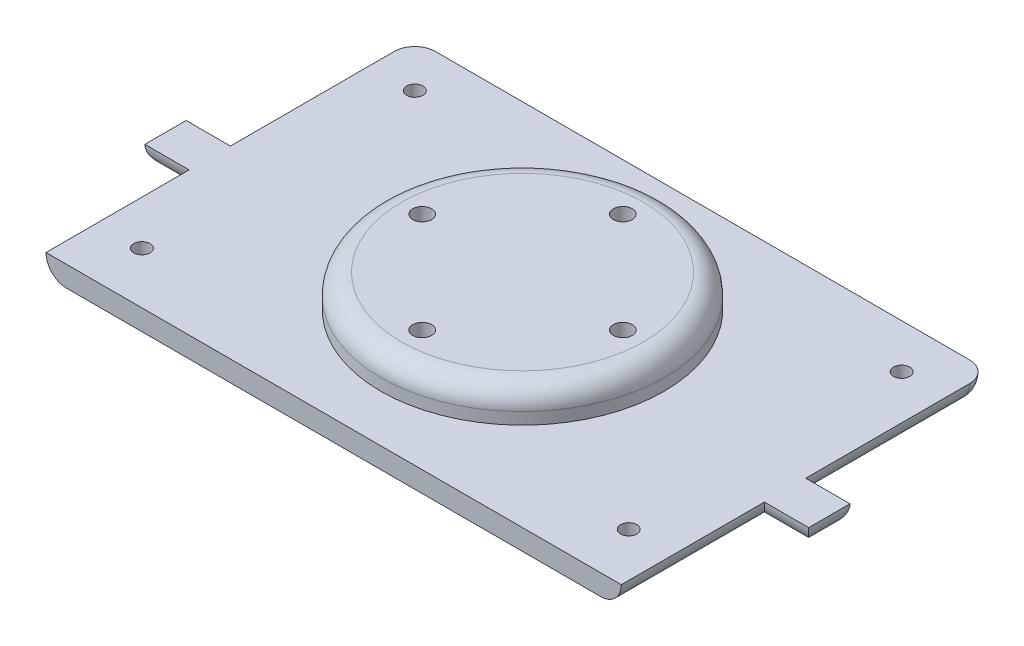
ISO-10303-21;
HEADER;
FILE_DESCRIPTION(('STEP AP214'),'2;1');
FILE_NAME('part.step','',(''),(''),'','','');
FILE_SCHEMA(('AUTOMOTIVE_DESIGN { 1 0 10303 214 1 1 1 1 }'));
ENDSEC;
DATA;
#1=APPLICATION_CONTEXT('core data for automotive mechanical design processes');
#2=APPLICATION_PROTOCOL_DEFINITION('international standard','automotive_design',2000,#1);
#3=PRODUCT_CONTEXT('',#1,'mechanical');
#4=PRODUCT('Part','Part','',(#3));
#5=PRODUCT_RELATED_PRODUCT_CATEGORY('part','',(#4));
#6=PRODUCT_DEFINITION_FORMATION('','',#4);
#7=PRODUCT_DEFINITION_CONTEXT('part definition',#1,'design');
#8=PRODUCT_DEFINITION('design','',#6,#7);
#9=PRODUCT_DEFINITION_SHAPE('','',#8);
#10=(LENGTH_UNIT() NAMED_UNIT(*) SI_UNIT(.MILLI.,.METRE.));
#11=(NAMED_UNIT(*) PLANE_ANGLE_UNIT() SI_UNIT($,.RADIAN.));
#12=(NAMED_UNIT(*) SI_UNIT($,.STERADIAN.) SOLID_ANGLE_UNIT());
#13=UNCERTAINTY_MEASURE_WITH_UNIT(LENGTH_MEASURE(1.E-05),#10,'distance_accuracy_value','');
#14=(GEOMETRIC_REPRESENTATION_CONTEXT(3) GLOBAL_UNCERTAINTY_ASSIGNED_CONTEXT((#13)) GLOBAL_UNIT_ASSIGNED_CONTEXT((#10,
#11,#12)) REPRESENTATION_CONTEXT('',''));
#15=CARTESIAN_POINT('',(0.,0.,0.));
#16=DIRECTION('',(0.,0.,1.));
#17=DIRECTION('',(1.,0.,0.));
#18=AXIS2_PLACEMENT_3D('',#15,#16,#17);
#19=CARTESIAN_POINT('',(0.,0.,0.));
#20=DIRECTION('',(0.,1.,0.));
#21=DIRECTION('',(0.,0.,1.));
#22=AXIS2_PLACEMENT_3D('',#19,#20,#21);
#23=PLANE('',#22);
#24=CARTESIAN_POINT('',(82.5,0.,-17.5));
#25=DIRECTION('',(0.,-1.,0.));
#26=DIRECTION('',(0.,0.,1.));
#27=AXIS2_PLACEMENT_3D('',#24,#25,#26);
#28=CIRCLE('',#27,2.75000000000001);
#29=CARTESIAN_POINT('',(82.5,0.,-14.75));
#30=VERTEX_POINT('',#29);
#31=EDGE_CURVE('E279',#30,#30,#28,.T.);
#32=ORIENTED_EDGE('',*,*,#31,.F.);
#33=EDGE_LOOP('',(#32));
#34=FACE_BOUND('',#33,.T.);
#35=CARTESIAN_POINT('',(82.5,0.,-110.));
#36=DIRECTION('',(0.,-1.,0.));
#37=DIRECTION('',(0.,0.,1.));
#38=AXIS2_PLACEMENT_3D('',#35,#36,#37);
#39=CIRCLE('',#38,2.75000000000001);
#40=CARTESIAN_POINT('',(82.5,0.,-107.25));
#41=VERTEX_POINT('',#40);
#42=EDGE_CURVE('E286',#41,#41,#39,.T.);
#43=ORIENTED_EDGE('',*,*,#42,.F.);
#44=EDGE_LOOP('',(#43));
#45=FACE_BOUND('',#44,.T.);
#46=CARTESIAN_POINT('',(-82.5,0.,-17.5));
#47=DIRECTION('',(0.,1.,0.));
#48=DIRECTION('',(0.,0.,1.));
#49=AXIS2_PLACEMENT_3D('',#46,#47,#48);
#50=CIRCLE('',#49,2.75000000000001);
#51=CARTESIAN_POINT('',(-82.5,0.,-14.75));
#52=VERTEX_POINT('',#51);
#53=EDGE_CURVE('E294',#52,#52,#50,.T.);
#54=ORIENTED_EDGE('',*,*,#53,.T.);
#55=EDGE_LOOP('',(#54));
#56=FACE_BOUND('',#55,.T.);
#57=CARTESIAN_POINT('',(-82.5,0.,-110.));
#58=DIRECTION('',(0.,1.,0.));
#59=DIRECTION('',(0.,0.,1.));
#60=AXIS2_PLACEMENT_3D('',#57,#58,#59);
#61=CIRCLE('',#60,2.75000000000001);
#62=CARTESIAN_POINT('',(-82.5,0.,-107.25));
#63=VERTEX_POINT('',#62);
#64=EDGE_CURVE('E293',#63,#63,#61,.T.);
#65=ORIENTED_EDGE('',*,*,#64,.T.);
#66=EDGE_LOOP('',(#65));
#67=FACE_BOUND('',#66,.T.);
#68=CARTESIAN_POINT('',(0.,0.,-64.));
#69=DIRECTION('',(0.,-1.,0.));
#70=DIRECTION('',(0.,0.,-1.));
#71=AXIS2_PLACEMENT_3D('',#68,#69,#70);
#72=CIRCLE('',#71,41.);
#73=CARTESIAN_POINT('',(0.,0.,-105.));
#74=VERTEX_POINT('',#73);
#75=EDGE_CURVE('E254',#74,#74,#72,.T.);
#76=ORIENTED_EDGE('',*,*,#75,.F.);
#77=EDGE_LOOP('',(#76));
#78=FACE_BOUND('',#77,.T.);
#79=DIRECTION('',(1.,0.,0.));
#80=VECTOR('',#79,1.);
#81=CARTESIAN_POINT('',(0.,0.,0.));
#82=LINE('',#81,#80);
#83=CARTESIAN_POINT('',(-90.5,0.,0.));
#84=VERTEX_POINT('',#83);
#85=CARTESIAN_POINT('',(90.5,0.,0.));
#86=VERTEX_POINT('',#85);
#87=EDGE_CURVE('E63',#84,#86,#82,.T.);
#88=ORIENTED_EDGE('',*,*,#87,.F.);
#89=DIRECTION('',(0.,0.,1.));
#90=VECTOR('',#89,1.);
#91=CARTESIAN_POINT('',(-90.5,0.,0.));
#92=LINE('',#91,#90);
#93=CARTESIAN_POINT('',(-90.5,0.,-55.5));
#94=VERTEX_POINT('',#93);
#95=EDGE_CURVE('E115',#84,#94,#92,.F.);
#96=ORIENTED_EDGE('',*,*,#95,.T.);
#97=DIRECTION('',(0.,0.,1.));
#98=VECTOR('',#97,1.);
#99=CARTESIAN_POINT('',(-90.5,0.,0.));
#100=LINE('',#99,#98);
#101=CARTESIAN_POINT('',(-90.5,0.,-118.));
#102=VERTEX_POINT('',#101);
#103=EDGE_CURVE('E108',#94,#102,#100,.F.);
#104=ORIENTED_EDGE('',*,*,#103,.T.);
#105=DIRECTION('',(1.,0.,0.));
#106=VECTOR('',#105,1.);
#107=CARTESIAN_POINT('',(90.4999999999999,0.,-118.));
#108=LINE('',#107,#106);
#109=CARTESIAN_POINT('',(-83.5,0.,-118.));
#110=VERTEX_POINT('',#109);
#111=EDGE_CURVE('E113',#102,#110,#108,.T.);
#112=ORIENTED_EDGE('',*,*,#111,.T.);
#113=DIRECTION('',(0.,0.,-1.));
#114=VECTOR('',#113,1.);
#115=CARTESIAN_POINT('',(-83.5,0.,125.002));
#116=LINE('',#115,#114);
#117=CARTESIAN_POINT('',(-83.5,0.,-125.));
#118=VERTEX_POINT('',#117);
#119=EDGE_CURVE('E270',#110,#118,#116,.T.);
#120=ORIENTED_EDGE('',*,*,#119,.T.);
#121=DIRECTION('',(-1.,0.,0.));
#122=VECTOR('',#121,1.);
#123=CARTESIAN_POINT('',(83.4999999999999,0.,-125.));
#124=LINE('',#123,#122);
#125=CARTESIAN_POINT('',(83.4999999999999,0.,-125.));
#126=VERTEX_POINT('',#125);
#127=EDGE_CURVE('E264',#126,#118,#124,.T.);
#128=ORIENTED_EDGE('',*,*,#127,.F.);
#129=DIRECTION('',(0.,0.,-1.));
#130=VECTOR('',#129,1.);
#131=CARTESIAN_POINT('',(83.4999999999999,0.,125.002));
#132=LINE('',#131,#130);
#133=CARTESIAN_POINT('',(83.4999999999999,0.,-118.));
#134=VERTEX_POINT('',#133);
#135=EDGE_CURVE('E272',#134,#126,#132,.T.);
#136=ORIENTED_EDGE('',*,*,#135,.F.);
#137=CARTESIAN_POINT('',(90.4999999999999,0.,-118.));
#138=VERTEX_POINT('',#137);
#139=EDGE_CURVE('E147',#134,#138,#108,.T.);
#140=ORIENTED_EDGE('',*,*,#139,.T.);
#141=DIRECTION('',(0.,0.,-1.));
#142=VECTOR('',#141,1.);
#143=CARTESIAN_POINT('',(90.5,0.,0.));
#144=LINE('',#143,#142);
#145=CARTESIAN_POINT('',(90.5,0.,-55.5));
#146=VERTEX_POINT('',#145);
#147=EDGE_CURVE('E71',#138,#146,#144,.F.);
#148=ORIENTED_EDGE('',*,*,#147,.T.);
#149=DIRECTION('',(0.,0.,-1.));
#150=VECTOR('',#149,1.);
#151=CARTESIAN_POINT('',(90.5,0.,0.));
#152=LINE('',#151,#150);
#153=EDGE_CURVE('E149',#146,#86,#152,.F.);
#154=ORIENTED_EDGE('',*,*,#153,.T.);
#155=EDGE_LOOP('',(#88,#96,#104,#112,#120,#128,#136,#140,#148,#154));
#156=FACE_BOUND('',#155,.T.);
#157=ADVANCED_FACE('F48',(#34,#45,#56,#67,#78,#156),#23,.F.);
#158=CARTESIAN_POINT('',(-112.5,7.00000000000001,55.5));
#159=DIRECTION('',(0.,-1.,0.));
#160=DIRECTION('',(0.,0.,-1.));
#161=AXIS2_PLACEMENT_3D('',#158,#159,#160);
#162=PLANE('',#161);
#163=CARTESIAN_POINT('',(-82.5,7.,-110.));
#164=DIRECTION('',(0.,1.,0.));
#165=DIRECTION('',(0.,0.,1.));
#166=AXIS2_PLACEMENT_3D('',#163,#164,#165);
#167=CIRCLE('',#166,2.75000000000001);
#168=CARTESIAN_POINT('',(-82.5,7.,-107.25));
#169=VERTEX_POINT('',#168);
#170=EDGE_CURVE('E298',#169,#169,#167,.T.);
#171=ORIENTED_EDGE('',*,*,#170,.F.);
#172=EDGE_LOOP('',(#171));
#173=FACE_BOUND('',#172,.T.);
#174=CARTESIAN_POINT('',(-82.5,7.,-17.5));
#175=DIRECTION('',(0.,1.,0.));
#176=DIRECTION('',(0.,0.,1.));
#177=AXIS2_PLACEMENT_3D('',#174,#175,#176);
#178=CIRCLE('',#177,2.75000000000001);
#179=CARTESIAN_POINT('',(-82.5,7.,-14.75));
#180=VERTEX_POINT('',#179);
#181=EDGE_CURVE('E297',#180,#180,#178,.T.);
#182=ORIENTED_EDGE('',*,*,#181,.F.);
#183=EDGE_LOOP('',(#182));
#184=FACE_BOUND('',#183,.T.);
#185=CARTESIAN_POINT('',(82.5,7.,-110.));
#186=DIRECTION('',(0.,1.,0.));
#187=DIRECTION('',(0.,0.,1.));
#188=AXIS2_PLACEMENT_3D('',#185,#186,#187);
#189=CIRCLE('',#188,2.75000000000001);
#190=CARTESIAN_POINT('',(82.5,7.,-107.25));
#191=VERTEX_POINT('',#190);
#192=EDGE_CURVE('E204',#191,#191,#189,.F.);
#193=ORIENTED_EDGE('',*,*,#192,.T.);
#194=EDGE_LOOP('',(#193));
#195=FACE_BOUND('',#194,.T.);
#196=CARTESIAN_POINT('',(82.5,7.,-17.5));
#197=DIRECTION('',(0.,1.,0.));
#198=DIRECTION('',(0.,0.,1.));
#199=AXIS2_PLACEMENT_3D('',#196,#197,#198);
#200=CIRCLE('',#199,2.75000000000001);
#201=CARTESIAN_POINT('',(82.5,7.,-14.75));
#202=VERTEX_POINT('',#201);
#203=EDGE_CURVE('E283',#202,#202,#200,.F.);
#204=ORIENTED_EDGE('',*,*,#203,.T.);
#205=EDGE_LOOP('',(#204));
#206=FACE_BOUND('',#205,.T.);
#207=CARTESIAN_POINT('',(0.,7.00000000000001,-64.));
#208=DIRECTION('',(0.,1.,0.));
#209=DIRECTION('',(0.,0.,1.));
#210=AXIS2_PLACEMENT_3D('',#207,#208,#209);
#211=CIRCLE('',#210,48.);
#212=CARTESIAN_POINT('',(0.,7.00000000000001,-16.));
#213=VERTEX_POINT('',#212);
#214=EDGE_CURVE('E253',#213,#213,#211,.T.);
#215=ORIENTED_EDGE('',*,*,#214,.F.);
#216=EDGE_LOOP('',(#215));
#217=FACE_BOUND('',#216,.T.);
#218=DIRECTION('',(-1.,0.,0.));
#219=VECTOR('',#218,1.);
#220=CARTESIAN_POINT('',(-112.5,7.00000000000001,0.));
#221=LINE('',#220,#219);
#222=CARTESIAN_POINT('',(97.5,7.,0.));
#223=VERTEX_POINT('',#222);
#224=CARTESIAN_POINT('',(-97.5,7.00000000000001,0.));
#225=VERTEX_POINT('',#224);
#226=EDGE_CURVE('E326',#223,#225,#221,.T.);
#227=ORIENTED_EDGE('',*,*,#226,.F.);
#228=DIRECTION('',(0.,0.,-1.));
#229=VECTOR('',#228,1.);
#230=CARTESIAN_POINT('',(97.5,7.,0.));
#231=LINE('',#230,#229);
#232=CARTESIAN_POINT('',(97.5,7.,-48.5));
#233=VERTEX_POINT('',#232);
#234=EDGE_CURVE('E164',#223,#233,#231,.T.);
#235=ORIENTED_EDGE('',*,*,#234,.T.);
#236=DIRECTION('',(-1.,0.,0.));
#237=VECTOR('',#236,1.);
#238=CARTESIAN_POINT('',(112.5,7.00000000000001,-48.5));
#239=LINE('',#238,#237);
#240=CARTESIAN_POINT('',(112.5,7.00000000000001,-48.5));
#241=VERTEX_POINT('',#240);
#242=EDGE_CURVE('E96',#241,#233,#239,.T.);
#243=ORIENTED_EDGE('',*,*,#242,.F.);
#244=DIRECTION('',(0.,0.,1.));
#245=VECTOR('',#244,1.);
#246=CARTESIAN_POINT('',(112.5,7.00000000000001,-55.5));
#247=LINE('',#246,#245);
#248=CARTESIAN_POINT('',(112.5,7.,-62.5));
#249=VERTEX_POINT('',#248);
#250=EDGE_CURVE('E282',#249,#241,#247,.T.);
#251=ORIENTED_EDGE('',*,*,#250,.F.);
#252=DIRECTION('',(-1.,0.,0.));
#253=VECTOR('',#252,1.);
#254=CARTESIAN_POINT('',(112.5,7.,-62.5));
#255=LINE('',#254,#253);
#256=CARTESIAN_POINT('',(97.5,7.,-62.5));
#257=VERTEX_POINT('',#256);
#258=EDGE_CURVE('E161',#249,#257,#255,.T.);
#259=ORIENTED_EDGE('',*,*,#258,.T.);
#260=DIRECTION('',(0.,0.,-1.));
#261=VECTOR('',#260,1.);
#262=CARTESIAN_POINT('',(97.5,7.,0.));
#263=LINE('',#262,#261);
#264=CARTESIAN_POINT('',(97.4999999999999,7.,-118.));
#265=VERTEX_POINT('',#264);
#266=EDGE_CURVE('E154',#257,#265,#263,.T.);
#267=ORIENTED_EDGE('',*,*,#266,.T.);
#268=CARTESIAN_POINT('',(90.4999999999999,7.,-118.));
#269=DIRECTION('',(0.,1.,0.));
#270=DIRECTION('',(0.,0.,1.));
#271=AXIS2_PLACEMENT_3D('',#268,#269,#270);
#272=CIRCLE('',#271,7.);
#273=CARTESIAN_POINT('',(90.4999999999999,7.,-125.));
#274=VERTEX_POINT('',#273);
#275=EDGE_CURVE('E157',#265,#274,#272,.T.);
#276=ORIENTED_EDGE('',*,*,#275,.T.);
#277=DIRECTION('',(1.,0.,0.));
#278=VECTOR('',#277,1.);
#279=CARTESIAN_POINT('',(-97.5,7.,-125.));
#280=LINE('',#279,#278);
#281=CARTESIAN_POINT('',(-90.5,7.,-125.));
#282=VERTEX_POINT('',#281);
#283=EDGE_CURVE('E259',#282,#274,#280,.T.);
#284=ORIENTED_EDGE('',*,*,#283,.F.);
#285=CARTESIAN_POINT('',(-90.5,7.,-118.));
#286=DIRECTION('',(0.,1.,0.));
#287=DIRECTION('',(0.,0.,1.));
#288=AXIS2_PLACEMENT_3D('',#285,#286,#287);
#289=CIRCLE('',#288,7.);
#290=CARTESIAN_POINT('',(-97.5,7.,-118.));
#291=VERTEX_POINT('',#290);
#292=EDGE_CURVE('E138',#282,#291,#289,.T.);
#293=ORIENTED_EDGE('',*,*,#292,.T.);
#294=DIRECTION('',(0.,0.,1.));
#295=VECTOR('',#294,1.);
#296=CARTESIAN_POINT('',(-97.5,7.,0.));
#297=LINE('',#296,#295);
#298=CARTESIAN_POINT('',(-97.5,7.,-62.5));
#299=VERTEX_POINT('',#298);
#300=EDGE_CURVE('E128',#291,#299,#297,.T.);
#301=ORIENTED_EDGE('',*,*,#300,.T.);
#302=DIRECTION('',(1.,0.,0.));
#303=VECTOR('',#302,1.);
#304=CARTESIAN_POINT('',(-112.5,7.,-62.5));
#305=LINE('',#304,#303);
#306=CARTESIAN_POINT('',(-112.5,7.,-62.5));
#307=VERTEX_POINT('',#306);
#308=EDGE_CURVE('E169',#299,#307,#305,.F.);
#309=ORIENTED_EDGE('',*,*,#308,.T.);
#310=DIRECTION('',(0.,0.,1.));
#311=VECTOR('',#310,1.);
#312=CARTESIAN_POINT('',(-112.5,7.00000000000001,-55.5));
#313=LINE('',#312,#311);
#314=CARTESIAN_POINT('',(-112.5,7.00000000000001,-48.5));
#315=VERTEX_POINT('',#314);
#316=EDGE_CURVE('E301',#307,#315,#313,.T.);
#317=ORIENTED_EDGE('',*,*,#316,.T.);
#318=DIRECTION('',(1.,0.,0.));
#319=VECTOR('',#318,1.);
#320=CARTESIAN_POINT('',(-112.5,7.00000000000001,-48.5));
#321=LINE('',#320,#319);
#322=CARTESIAN_POINT('',(-97.5,7.,-48.5));
#323=VERTEX_POINT('',#322);
#324=EDGE_CURVE('E119',#315,#323,#321,.T.);
#325=ORIENTED_EDGE('',*,*,#324,.T.);
#326=DIRECTION('',(0.,0.,1.));
#327=VECTOR('',#326,1.);
#328=CARTESIAN_POINT('',(-97.5,7.,0.));
#329=LINE('',#328,#327);
#330=EDGE_CURVE('E166',#323,#225,#329,.T.);
#331=ORIENTED_EDGE('',*,*,#330,.T.);
#332=EDGE_LOOP('',(#227,#235,#243,#251,#259,#267,#276,#284,#293,#301,#309,#317,#325,#331));
#333=FACE_BOUND('',#332,.T.);
#334=ADVANCED_FACE('F312',(#173,#184,#195,#206,#217,#333),#162,.F.);
#335=CARTESIAN_POINT('',(-90.5,7.,0.));
#336=DIRECTION('',(0.,0.,1.));
#337=DIRECTION('',(1.,0.,0.));
#338=AXIS2_PLACEMENT_3D('',#335,#336,#337);
#339=CYLINDRICAL_SURFACE('',#338,7.);
#340=ORIENTED_EDGE('',*,*,#95,.F.);
#341=CARTESIAN_POINT('',(-90.5,7.,0.));
#342=DIRECTION('',(0.,0.,1.));
#343=DIRECTION('',(1.,0.,0.));
#344=AXIS2_PLACEMENT_3D('',#341,#342,#343);
#345=CIRCLE('',#344,7.);
#346=EDGE_CURVE('E240',#84,#225,#345,.F.);
#347=ORIENTED_EDGE('',*,*,#346,.T.);
#348=ORIENTED_EDGE('',*,*,#330,.F.);
#349=CARTESIAN_POINT('',(-90.5,7.,-55.5));
#350=DIRECTION('',(0.707106781186547,0.,0.707106781186547));
#351=DIRECTION('',(-0.707106781186548,0.,0.707106781186547));
#352=AXIS2_PLACEMENT_3D('',#349,#350,#351);
#353=ELLIPSE('',#352,9.89949493661167,7.);
#354=EDGE_CURVE('E142',#323,#94,#353,.T.);
#355=ORIENTED_EDGE('',*,*,#354,.T.);
#356=EDGE_LOOP('',(#340,#347,#348,#355));
#357=FACE_BOUND('',#356,.T.);
#358=ADVANCED_FACE('F321',(#357),#339,.T.);
#359=CARTESIAN_POINT('',(90.5,7.,0.));
#360=DIRECTION('',(0.,0.,-1.));
#361=DIRECTION('',(-1.,0.,0.));
#362=AXIS2_PLACEMENT_3D('',#359,#360,#361);
#363=CYLINDRICAL_SURFACE('',#362,7.);
#364=ORIENTED_EDGE('',*,*,#234,.F.);
#365=CARTESIAN_POINT('',(90.5,7.,0.));
#366=DIRECTION('',(0.,0.,1.));
#367=DIRECTION('',(1.,0.,0.));
#368=AXIS2_PLACEMENT_3D('',#365,#366,#367);
#369=CIRCLE('',#368,7.);
#370=EDGE_CURVE('E12',#223,#86,#369,.F.);
#371=ORIENTED_EDGE('',*,*,#370,.T.);
#372=ORIENTED_EDGE('',*,*,#153,.F.);
#373=CARTESIAN_POINT('',(90.5,7.,-55.5));
#374=DIRECTION('',(-0.707106781186547,0.,0.707106781186548));
#375=DIRECTION('',(-0.707106781186548,0.,-0.707106781186547));
#376=AXIS2_PLACEMENT_3D('',#373,#374,#375);
#377=ELLIPSE('',#376,9.89949493661167,7.);
#378=EDGE_CURVE('E174',#146,#233,#377,.T.);
#379=ORIENTED_EDGE('',*,*,#378,.T.);
#380=EDGE_LOOP('',(#364,#371,#372,#379));
#381=FACE_BOUND('',#380,.T.);
#382=ADVANCED_FACE('F374',(#381),#363,.T.);
#383=CARTESIAN_POINT('',(-97.5,57.,-125.));
#384=DIRECTION('',(0.,0.,-1.));
#385=DIRECTION('',(-1.,0.,0.));
#386=AXIS2_PLACEMENT_3D('',#383,#384,#385);
#387=PLANE('',#386);
#388=CARTESIAN_POINT('',(-83.5,7.,-125.));
#389=DIRECTION('',(0.,0.,-1.));
#390=DIRECTION('',(-1.,0.,0.));
#391=AXIS2_PLACEMENT_3D('',#388,#389,#390);
#392=CIRCLE('',#391,7.);
#393=EDGE_CURVE('E267',#118,#282,#392,.T.);
#394=ORIENTED_EDGE('',*,*,#393,.T.);
#395=ORIENTED_EDGE('',*,*,#283,.T.);
#396=CARTESIAN_POINT('',(83.4999999999999,7.,-125.));
#397=DIRECTION('',(0.,0.,-1.));
#398=DIRECTION('',(-1.,0.,0.));
#399=AXIS2_PLACEMENT_3D('',#396,#397,#398);
#400=CIRCLE('',#399,7.);
#401=EDGE_CURVE('E178',#274,#126,#400,.T.);
#402=ORIENTED_EDGE('',*,*,#401,.T.);
#403=ORIENTED_EDGE('',*,*,#127,.T.);
#404=EDGE_LOOP('',(#394,#395,#402,#403));
#405=FACE_BOUND('',#404,.T.);
#406=ADVANCED_FACE('F377',(#405),#387,.T.);
#407=CARTESIAN_POINT('',(0.,7.,-118.));
#408=DIRECTION('',(-1.,0.,0.));
#409=DIRECTION('',(0.,0.,1.));
#410=AXIS2_PLACEMENT_3D('',#407,#408,#409);
#411=CYLINDRICAL_SURFACE('',#410,7.);
#412=CARTESIAN_POINT('',(-83.5,7.,-118.));
#413=DIRECTION('',(0.707106781186548,0.,-0.707106781186547));
#414=DIRECTION('',(-0.707106781186547,0.,-0.707106781186548));
#415=AXIS2_PLACEMENT_3D('',#412,#413,#414);
#416=ELLIPSE('',#415,9.89949493661167,7.);
#417=EDGE_CURVE('E146',#282,#110,#416,.F.);
#418=ORIENTED_EDGE('',*,*,#417,.T.);
#419=ORIENTED_EDGE('',*,*,#111,.F.);
#420=CARTESIAN_POINT('',(-90.5,7.,-118.));
#421=DIRECTION('',(1.,0.,0.));
#422=DIRECTION('',(0.,0.,-1.));
#423=AXIS2_PLACEMENT_3D('',#420,#421,#422);
#424=CIRCLE('',#423,7.);
#425=EDGE_CURVE('E134',#102,#282,#424,.T.);
#426=ORIENTED_EDGE('',*,*,#425,.T.);
#427=EDGE_LOOP('',(#418,#419,#426));
#428=FACE_BOUND('',#427,.T.);
#429=ADVANCED_FACE('F144',(#428),#411,.T.);
#430=CARTESIAN_POINT('',(-82.5,57.001,-110.));
#431=DIRECTION('',(0.,-1.,0.));
#432=DIRECTION('',(0.,0.,-1.));
#433=AXIS2_PLACEMENT_3D('',#430,#431,#432);
#434=CYLINDRICAL_SURFACE('',#433,2.75000000000001);
#435=ORIENTED_EDGE('',*,*,#170,.T.);
#436=EDGE_LOOP('',(#435));
#437=FACE_BOUND('',#436,.T.);
#438=ORIENTED_EDGE('',*,*,#64,.F.);
#439=EDGE_LOOP('',(#438));
#440=FACE_BOUND('',#439,.T.);
#441=ADVANCED_FACE('F440',(#437,#440),#434,.F.);
#442=CARTESIAN_POINT('',(-82.5,57.001,-17.5));
#443=DIRECTION('',(0.,-1.,0.));
#444=DIRECTION('',(0.,0.,-1.));
#445=AXIS2_PLACEMENT_3D('',#442,#443,#444);
#446=CYLINDRICAL_SURFACE('',#445,2.75000000000001);
#447=ORIENTED_EDGE('',*,*,#181,.T.);
#448=EDGE_LOOP('',(#447));
#449=FACE_BOUND('',#448,.T.);
#450=ORIENTED_EDGE('',*,*,#53,.F.);
#451=EDGE_LOOP('',(#450));
#452=FACE_BOUND('',#451,.T.);
#453=ADVANCED_FACE('F429',(#449,#452),#446,.F.);
#454=CARTESIAN_POINT('',(82.5,57.001,-110.));
#455=DIRECTION('',(0.,-1.,0.));
#456=DIRECTION('',(0.,0.,-1.));
#457=AXIS2_PLACEMENT_3D('',#454,#455,#456);
#458=CYLINDRICAL_SURFACE('',#457,2.75000000000001);
#459=ORIENTED_EDGE('',*,*,#192,.F.);
#460=EDGE_LOOP('',(#459));
#461=FACE_BOUND('',#460,.T.);
#462=ORIENTED_EDGE('',*,*,#42,.T.);
#463=EDGE_LOOP('',(#462));
#464=FACE_BOUND('',#463,.T.);
#465=ADVANCED_FACE('F422',(#461,#464),#458,.F.);
#466=CARTESIAN_POINT('',(82.5,57.001,-17.5));
#467=DIRECTION('',(0.,-1.,0.));
#468=DIRECTION('',(0.,0.,-1.));
#469=AXIS2_PLACEMENT_3D('',#466,#467,#468);
#470=CYLINDRICAL_SURFACE('',#469,2.75000000000001);
#471=ORIENTED_EDGE('',*,*,#203,.F.);
#472=EDGE_LOOP('',(#471));
#473=FACE_BOUND('',#472,.T.);
#474=ORIENTED_EDGE('',*,*,#31,.T.);
#475=EDGE_LOOP('',(#474));
#476=FACE_BOUND('',#475,.T.);
#477=ADVANCED_FACE('F417',(#473,#476),#470,.F.);
#478=CARTESIAN_POINT('',(-90.5,7.,0.));
#479=DIRECTION('',(0.,0.,1.));
#480=DIRECTION('',(1.,0.,0.));
#481=AXIS2_PLACEMENT_3D('',#478,#479,#480);
#482=CYLINDRICAL_SURFACE('',#481,7.);
#483=CARTESIAN_POINT('',(-90.5,7.,-55.5));
#484=DIRECTION('',(-0.707106781186548,0.,0.707106781186547));
#485=DIRECTION('',(-0.707106781186547,0.,-0.707106781186547));
#486=AXIS2_PLACEMENT_3D('',#483,#484,#485);
#487=ELLIPSE('',#486,9.89949493661167,7.);
#488=EDGE_CURVE('E202',#299,#94,#487,.T.);
#489=ORIENTED_EDGE('',*,*,#488,.F.);
#490=ORIENTED_EDGE('',*,*,#300,.F.);
#491=CARTESIAN_POINT('',(-90.5,7.,-118.));
#492=DIRECTION('',(0.,0.,-1.));
#493=DIRECTION('',(-1.,0.,0.));
#494=AXIS2_PLACEMENT_3D('',#491,#492,#493);
#495=CIRCLE('',#494,7.);
#496=EDGE_CURVE('E123',#102,#291,#495,.T.);
#497=ORIENTED_EDGE('',*,*,#496,.F.);
#498=ORIENTED_EDGE('',*,*,#103,.F.);
#499=EDGE_LOOP('',(#489,#490,#497,#498));
#500=FACE_BOUND('',#499,.T.);
#501=ADVANCED_FACE('F125',(#500),#482,.T.);
#502=CARTESIAN_POINT('',(0.,7.,-55.5));
#503=DIRECTION('',(-1.,0.,0.));
#504=DIRECTION('',(0.,0.,1.));
#505=AXIS2_PLACEMENT_3D('',#502,#503,#504);
#506=CYLINDRICAL_SURFACE('',#505,7.);
#507=CARTESIAN_POINT('',(-105.5,7.,-55.5));
#508=DIRECTION('',(-0.707106781186548,0.,0.707106781186547));
#509=DIRECTION('',(-0.707106781186547,0.,-0.707106781186547));
#510=AXIS2_PLACEMENT_3D('',#507,#508,#509);
#511=ELLIPSE('',#510,9.89949493661167,7.);
#512=CARTESIAN_POINT('',(-105.5,0.,-55.5));
#513=VERTEX_POINT('',#512);
#514=EDGE_CURVE('E87',#307,#513,#511,.T.);
#515=ORIENTED_EDGE('',*,*,#514,.F.);
#516=ORIENTED_EDGE('',*,*,#308,.F.);
#517=ORIENTED_EDGE('',*,*,#488,.T.);
#518=DIRECTION('',(1.,0.,0.));
#519=VECTOR('',#518,1.);
#520=CARTESIAN_POINT('',(-97.5,0.,-55.5));
#521=LINE('',#520,#519);
#522=EDGE_CURVE('E131',#513,#94,#521,.T.);
#523=ORIENTED_EDGE('',*,*,#522,.F.);
#524=EDGE_LOOP('',(#515,#516,#517,#523));
#525=FACE_BOUND('',#524,.T.);
#526=ADVANCED_FACE('F413',(#525),#506,.T.);
#527=CARTESIAN_POINT('',(-105.5,7.,0.));
#528=DIRECTION('',(0.,0.,1.));
#529=DIRECTION('',(1.,0.,0.));
#530=AXIS2_PLACEMENT_3D('',#527,#528,#529);
#531=CYLINDRICAL_SURFACE('',#530,7.);
#532=ORIENTED_EDGE('',*,*,#316,.F.);
#533=ORIENTED_EDGE('',*,*,#514,.T.);
#534=CARTESIAN_POINT('',(-105.5,7.,-55.5));
#535=DIRECTION('',(0.707106781186547,0.,0.707106781186547));
#536=DIRECTION('',(-0.707106781186548,0.,0.707106781186547));
#537=AXIS2_PLACEMENT_3D('',#534,#535,#536);
#538=ELLIPSE('',#537,9.89949493661167,7.);
#539=EDGE_CURVE('E141',#315,#513,#538,.T.);
#540=ORIENTED_EDGE('',*,*,#539,.F.);
#541=EDGE_LOOP('',(#532,#533,#540));
#542=FACE_BOUND('',#541,.T.);
#543=ADVANCED_FACE('F410',(#542),#531,.T.);
#544=CARTESIAN_POINT('',(-90.5,7.,-118.));
#545=DIRECTION('',(0.,1.,0.));
#546=DIRECTION('',(0.,0.,1.));
#547=AXIS2_PLACEMENT_3D('',#544,#545,#546);
#548=SPHERICAL_SURFACE('',#547,7.);
#549=ORIENTED_EDGE('',*,*,#496,.T.);
#550=ORIENTED_EDGE('',*,*,#292,.F.);
#551=ORIENTED_EDGE('',*,*,#425,.F.);
#552=EDGE_LOOP('',(#549,#550,#551));
#553=FACE_BOUND('',#552,.T.);
#554=ADVANCED_FACE('F135',(#553),#548,.T.);
#555=CARTESIAN_POINT('',(-112.5,7.,-55.5));
#556=DIRECTION('',(-1.,0.,0.));
#557=DIRECTION('',(0.,0.,1.));
#558=AXIS2_PLACEMENT_3D('',#555,#556,#557);
#559=CYLINDRICAL_SURFACE('',#558,7.);
#560=ORIENTED_EDGE('',*,*,#539,.T.);
#561=ORIENTED_EDGE('',*,*,#522,.T.);
#562=ORIENTED_EDGE('',*,*,#354,.F.);
#563=ORIENTED_EDGE('',*,*,#324,.F.);
#564=EDGE_LOOP('',(#560,#561,#562,#563));
#565=FACE_BOUND('',#564,.T.);
#566=ADVANCED_FACE('F319',(#565),#559,.T.);
#567=CARTESIAN_POINT('',(83.4999999999999,7.,-118.));
#568=DIRECTION('',(-0.707106781186547,0.,-0.707106781186548));
#569=DIRECTION('',(0.707106781186548,0.,-0.707106781186547));
#570=AXIS2_PLACEMENT_3D('',#567,#568,#569);
#571=ELLIPSE('',#570,9.89949493661167,7.);
#572=EDGE_CURVE('E275',#134,#274,#571,.F.);
#573=ORIENTED_EDGE('',*,*,#572,.T.);
#574=CARTESIAN_POINT('',(90.4999999999999,7.,-118.));
#575=DIRECTION('',(1.,0.,0.));
#576=DIRECTION('',(0.,0.,-1.));
#577=AXIS2_PLACEMENT_3D('',#574,#575,#576);
#578=CIRCLE('',#577,7.);
#579=EDGE_CURVE('E192',#138,#274,#578,.T.);
#580=ORIENTED_EDGE('',*,*,#579,.F.);
#581=ORIENTED_EDGE('',*,*,#139,.F.);
#582=EDGE_LOOP('',(#573,#580,#581));
#583=FACE_BOUND('',#582,.T.);
#584=ADVANCED_FACE('F399',(#583),#411,.T.);
#585=CARTESIAN_POINT('',(90.4999999999999,7.,-118.));
#586=DIRECTION('',(0.,1.,0.));
#587=DIRECTION('',(0.,0.,1.));
#588=AXIS2_PLACEMENT_3D('',#585,#586,#587);
#589=SPHERICAL_SURFACE('',#588,7.);
#590=ORIENTED_EDGE('',*,*,#579,.T.);
#591=ORIENTED_EDGE('',*,*,#275,.F.);
#592=CARTESIAN_POINT('',(90.4999999999999,7.,-118.));
#593=DIRECTION('',(0.,0.,1.));
#594=DIRECTION('',(1.,0.,0.));
#595=AXIS2_PLACEMENT_3D('',#592,#593,#594);
#596=CIRCLE('',#595,7.);
#597=EDGE_CURVE('E189',#138,#265,#596,.T.);
#598=ORIENTED_EDGE('',*,*,#597,.F.);
#599=EDGE_LOOP('',(#590,#591,#598));
#600=FACE_BOUND('',#599,.T.);
#601=ADVANCED_FACE('F395',(#600),#589,.T.);
#602=CARTESIAN_POINT('',(90.5,7.,0.));
#603=DIRECTION('',(0.,0.,-1.));
#604=DIRECTION('',(-1.,0.,0.));
#605=AXIS2_PLACEMENT_3D('',#602,#603,#604);
#606=CYLINDRICAL_SURFACE('',#605,7.);
#607=ORIENTED_EDGE('',*,*,#597,.T.);
#608=ORIENTED_EDGE('',*,*,#266,.F.);
#609=CARTESIAN_POINT('',(90.5,7.,-55.5));
#610=DIRECTION('',(-0.707106781186548,0.,-0.707106781186547));
#611=DIRECTION('',(0.707106781186547,0.,-0.707106781186548));
#612=AXIS2_PLACEMENT_3D('',#609,#610,#611);
#613=ELLIPSE('',#612,9.89949493661166,7.);
#614=EDGE_CURVE('E184',#146,#257,#613,.F.);
#615=ORIENTED_EDGE('',*,*,#614,.F.);
#616=ORIENTED_EDGE('',*,*,#147,.F.);
#617=EDGE_LOOP('',(#607,#608,#615,#616));
#618=FACE_BOUND('',#617,.T.);
#619=ADVANCED_FACE('F391',(#618),#606,.T.);
#620=CARTESIAN_POINT('',(105.5,7.,0.));
#621=DIRECTION('',(0.,0.,1.));
#622=DIRECTION('',(1.,0.,0.));
#623=AXIS2_PLACEMENT_3D('',#620,#621,#622);
#624=CYLINDRICAL_SURFACE('',#623,7.);
#625=CARTESIAN_POINT('',(105.5,7.,-55.5));
#626=DIRECTION('',(-0.707106781186548,0.,-0.707106781186547));
#627=DIRECTION('',(-0.707106781186547,0.,0.707106781186547));
#628=AXIS2_PLACEMENT_3D('',#625,#626,#627);
#629=ELLIPSE('',#628,9.89949493661167,7.);
#630=CARTESIAN_POINT('',(105.5,0.,-55.5));
#631=VERTEX_POINT('',#630);
#632=EDGE_CURVE('E187',#249,#631,#629,.T.);
#633=ORIENTED_EDGE('',*,*,#632,.F.);
#634=ORIENTED_EDGE('',*,*,#250,.T.);
#635=CARTESIAN_POINT('',(105.5,7.,-55.5));
#636=DIRECTION('',(-0.707106781186547,0.,0.707106781186547));
#637=DIRECTION('',(0.707106781186548,0.,0.707106781186547));
#638=AXIS2_PLACEMENT_3D('',#635,#636,#637);
#639=ELLIPSE('',#638,9.89949493661167,7.);
#640=EDGE_CURVE('E181',#631,#241,#639,.T.);
#641=ORIENTED_EDGE('',*,*,#640,.F.);
#642=EDGE_LOOP('',(#633,#634,#641));
#643=FACE_BOUND('',#642,.T.);
#644=ADVANCED_FACE('F387',(#643),#624,.T.);
#645=CARTESIAN_POINT('',(112.5,7.,-55.5));
#646=DIRECTION('',(-1.,0.,0.));
#647=DIRECTION('',(0.,0.,1.));
#648=AXIS2_PLACEMENT_3D('',#645,#646,#647);
#649=CYLINDRICAL_SURFACE('',#648,7.);
#650=ORIENTED_EDGE('',*,*,#258,.F.);
#651=ORIENTED_EDGE('',*,*,#632,.T.);
#652=DIRECTION('',(-1.,0.,0.));
#653=VECTOR('',#652,1.);
#654=CARTESIAN_POINT('',(0.,0.,-55.5));
#655=LINE('',#654,#653);
#656=EDGE_CURVE('E177',#146,#631,#655,.F.);
#657=ORIENTED_EDGE('',*,*,#656,.F.);
#658=ORIENTED_EDGE('',*,*,#614,.T.);
#659=EDGE_LOOP('',(#650,#651,#657,#658));
#660=FACE_BOUND('',#659,.T.);
#661=ADVANCED_FACE('F383',(#660),#649,.T.);
#662=CARTESIAN_POINT('',(0.,7.,-55.5));
#663=DIRECTION('',(-1.,0.,0.));
#664=DIRECTION('',(0.,0.,1.));
#665=AXIS2_PLACEMENT_3D('',#662,#663,#664);
#666=CYLINDRICAL_SURFACE('',#665,7.);
#667=ORIENTED_EDGE('',*,*,#640,.T.);
#668=ORIENTED_EDGE('',*,*,#242,.T.);
#669=ORIENTED_EDGE('',*,*,#378,.F.);
#670=ORIENTED_EDGE('',*,*,#656,.T.);
#671=EDGE_LOOP('',(#667,#668,#669,#670));
#672=FACE_BOUND('',#671,.T.);
#673=ADVANCED_FACE('F379',(#672),#666,.T.);
#674=CARTESIAN_POINT('',(-83.5,7.,125.002));
#675=DIRECTION('',(0.,0.,-1.));
#676=DIRECTION('',(-1.,0.,0.));
#677=AXIS2_PLACEMENT_3D('',#674,#675,#676);
#678=CYLINDRICAL_SURFACE('',#677,7.);
#679=ORIENTED_EDGE('',*,*,#417,.F.);
#680=ORIENTED_EDGE('',*,*,#393,.F.);
#681=ORIENTED_EDGE('',*,*,#119,.F.);
#682=EDGE_LOOP('',(#679,#680,#681));
#683=FACE_BOUND('',#682,.T.);
#684=ADVANCED_FACE('F382',(#683),#678,.T.);
#685=CARTESIAN_POINT('',(83.4999999999999,7.,125.002));
#686=DIRECTION('',(0.,0.,-1.));
#687=DIRECTION('',(-1.,0.,0.));
#688=AXIS2_PLACEMENT_3D('',#685,#686,#687);
#689=CYLINDRICAL_SURFACE('',#688,7.);
#690=ORIENTED_EDGE('',*,*,#572,.F.);
#691=ORIENTED_EDGE('',*,*,#135,.T.);
#692=ORIENTED_EDGE('',*,*,#401,.F.);
#693=EDGE_LOOP('',(#690,#691,#692));
#694=FACE_BOUND('',#693,.T.);
#695=ADVANCED_FACE('F435',(#694),#689,.T.);
#696=CARTESIAN_POINT('',(0.,18.,-64.));
#697=DIRECTION('',(0.,-1.,0.));
#698=DIRECTION('',(0.,0.,-1.));
#699=AXIS2_PLACEMENT_3D('',#696,#697,#698);
#700=CYLINDRICAL_SURFACE('',#699,48.);
#701=CARTESIAN_POINT('',(0.,11.,-64.));
#702=DIRECTION('',(0.,1.,0.));
#703=DIRECTION('',(0.,0.,1.));
#704=AXIS2_PLACEMENT_3D('',#701,#702,#703);
#705=CIRCLE('',#704,48.);
#706=CARTESIAN_POINT('',(0.,11.,-16.));
#707=VERTEX_POINT('',#706);
#708=EDGE_CURVE('E56',#707,#707,#705,.F.);
#709=ORIENTED_EDGE('',*,*,#708,.T.);
#710=EDGE_LOOP('',(#709));
#711=FACE_BOUND('',#710,.T.);
#712=ORIENTED_EDGE('',*,*,#214,.T.);
#713=EDGE_LOOP('',(#712));
#714=FACE_BOUND('',#713,.T.);
#715=ADVANCED_FACE('F209',(#711,#714),#700,.T.);
#716=CARTESIAN_POINT('',(0.,18.,-64.));
#717=DIRECTION('',(0.,1.,0.));
#718=DIRECTION('',(0.,0.,1.));
#719=AXIS2_PLACEMENT_3D('',#716,#717,#718);
#720=PLANE('',#719);
#721=CARTESIAN_POINT('',(0.,18.,-64.));
#722=DIRECTION('',(0.,1.,0.));
#723=DIRECTION('',(0.,0.,1.));
#724=AXIS2_PLACEMENT_3D('',#721,#722,#723);
#725=CIRCLE('',#724,41.);
#726=CARTESIAN_POINT('',(0.,18.,-23.));
#727=VERTEX_POINT('',#726);
#728=EDGE_CURVE('E173',#727,#727,#725,.T.);
#729=ORIENTED_EDGE('',*,*,#728,.T.);
#730=EDGE_LOOP('',(#729));
#731=FACE_BOUND('',#730,.T.);
#732=CARTESIAN_POINT('',(0.,18.,-30.));
#733=DIRECTION('',(0.,1.,0.));
#734=DIRECTION('',(0.,0.,1.));
#735=AXIS2_PLACEMENT_3D('',#732,#733,#734);
#736=CIRCLE('',#735,3.2);
#737=CARTESIAN_POINT('',(0.,18.,-26.8));
#738=VERTEX_POINT('',#737);
#739=EDGE_CURVE('E226',#738,#738,#736,.F.);
#740=ORIENTED_EDGE('',*,*,#739,.T.);
#741=EDGE_LOOP('',(#740));
#742=FACE_BOUND('',#741,.T.);
#743=CARTESIAN_POINT('',(0.,18.,-98.));
#744=DIRECTION('',(0.,1.,0.));
#745=DIRECTION('',(0.,0.,1.));
#746=AXIS2_PLACEMENT_3D('',#743,#744,#745);
#747=CIRCLE('',#746,3.2);
#748=CARTESIAN_POINT('',(0.,18.,-94.8));
#749=VERTEX_POINT('',#748);
#750=EDGE_CURVE('E230',#749,#749,#747,.F.);
#751=ORIENTED_EDGE('',*,*,#750,.T.);
#752=EDGE_LOOP('',(#751));
#753=FACE_BOUND('',#752,.T.);
#754=CARTESIAN_POINT('',(34.,18.,-64.));
#755=DIRECTION('',(0.,1.,0.));
#756=DIRECTION('',(0.,0.,1.));
#757=AXIS2_PLACEMENT_3D('',#754,#755,#756);
#758=CIRCLE('',#757,3.2);
#759=CARTESIAN_POINT('',(34.,18.,-60.8));
#760=VERTEX_POINT('',#759);
#761=EDGE_CURVE('E234',#760,#760,#758,.F.);
#762=ORIENTED_EDGE('',*,*,#761,.T.);
#763=EDGE_LOOP('',(#762));
#764=FACE_BOUND('',#763,.T.);
#765=CARTESIAN_POINT('',(-34.,18.,-64.));
#766=DIRECTION('',(0.,1.,0.));
#767=DIRECTION('',(0.,0.,1.));
#768=AXIS2_PLACEMENT_3D('',#765,#766,#767);
#769=CIRCLE('',#768,3.2);
#770=CARTESIAN_POINT('',(-34.,18.,-60.8));
#771=VERTEX_POINT('',#770);
#772=EDGE_CURVE('E237',#771,#771,#769,.F.);
#773=ORIENTED_EDGE('',*,*,#772,.T.);
#774=EDGE_LOOP('',(#773));
#775=FACE_BOUND('',#774,.T.);
#776=ADVANCED_FACE('F218',(#731,#742,#753,#764,#775),#720,.T.);
#777=CARTESIAN_POINT('',(0.,11.,-64.));
#778=DIRECTION('',(0.,-1.,0.));
#779=DIRECTION('',(0.,0.,-1.));
#780=AXIS2_PLACEMENT_3D('',#777,#778,#779);
#781=CYLINDRICAL_SURFACE('',#780,41.);
#782=CARTESIAN_POINT('',(0.,11.,-64.));
#783=DIRECTION('',(0.,-1.,0.));
#784=DIRECTION('',(0.,0.,-1.));
#785=AXIS2_PLACEMENT_3D('',#782,#783,#784);
#786=CIRCLE('',#785,41.);
#787=CARTESIAN_POINT('',(0.,11.,-105.));
#788=VERTEX_POINT('',#787);
#789=EDGE_CURVE('E250',#788,#788,#786,.T.);
#790=ORIENTED_EDGE('',*,*,#789,.F.);
#791=EDGE_LOOP('',(#790));
#792=FACE_BOUND('',#791,.T.);
#793=ORIENTED_EDGE('',*,*,#75,.T.);
#794=EDGE_LOOP('',(#793));
#795=FACE_BOUND('',#794,.T.);
#796=ADVANCED_FACE('F221',(#792,#795),#781,.F.);
#797=CARTESIAN_POINT('',(0.,11.,-64.));
#798=DIRECTION('',(0.,-1.,0.));
#799=DIRECTION('',(0.,0.,-1.));
#800=AXIS2_PLACEMENT_3D('',#797,#798,#799);
#801=PLANE('',#800);
#802=CARTESIAN_POINT('',(0.,11.,-30.));
#803=DIRECTION('',(0.,-1.,0.));
#804=DIRECTION('',(0.,0.,-1.));
#805=AXIS2_PLACEMENT_3D('',#802,#803,#804);
#806=CIRCLE('',#805,3.2);
#807=CARTESIAN_POINT('',(0.,11.,-33.2));
#808=VERTEX_POINT('',#807);
#809=EDGE_CURVE('E333',#808,#808,#806,.T.);
#810=ORIENTED_EDGE('',*,*,#809,.F.);
#811=EDGE_LOOP('',(#810));
#812=FACE_BOUND('',#811,.T.);
#813=CARTESIAN_POINT('',(0.,11.,-98.));
#814=DIRECTION('',(0.,-1.,0.));
#815=DIRECTION('',(0.,0.,-1.));
#816=AXIS2_PLACEMENT_3D('',#813,#814,#815);
#817=CIRCLE('',#816,3.2);
#818=CARTESIAN_POINT('',(0.,11.,-101.2));
#819=VERTEX_POINT('',#818);
#820=EDGE_CURVE('E336',#819,#819,#817,.T.);
#821=ORIENTED_EDGE('',*,*,#820,.F.);
#822=EDGE_LOOP('',(#821));
#823=FACE_BOUND('',#822,.T.);
#824=CARTESIAN_POINT('',(34.,11.,-64.));
#825=DIRECTION('',(0.,-1.,0.));
#826=DIRECTION('',(0.,0.,-1.));
#827=AXIS2_PLACEMENT_3D('',#824,#825,#826);
#828=CIRCLE('',#827,3.2);
#829=CARTESIAN_POINT('',(34.,11.,-67.2));
#830=VERTEX_POINT('',#829);
#831=EDGE_CURVE('E247',#830,#830,#828,.T.);
#832=ORIENTED_EDGE('',*,*,#831,.F.);
#833=EDGE_LOOP('',(#832));
#834=FACE_BOUND('',#833,.T.);
#835=CARTESIAN_POINT('',(-34.,11.,-64.));
#836=DIRECTION('',(0.,-1.,0.));
#837=DIRECTION('',(0.,0.,-1.));
#838=AXIS2_PLACEMENT_3D('',#835,#836,#837);
#839=CIRCLE('',#838,3.2);
#840=CARTESIAN_POINT('',(-34.,11.,-67.2));
#841=VERTEX_POINT('',#840);
#842=EDGE_CURVE('E239',#841,#841,#839,.T.);
#843=ORIENTED_EDGE('',*,*,#842,.F.);
#844=EDGE_LOOP('',(#843));
#845=FACE_BOUND('',#844,.T.);
#846=ORIENTED_EDGE('',*,*,#789,.T.);
#847=EDGE_LOOP('',(#846));
#848=FACE_BOUND('',#847,.T.);
#849=ADVANCED_FACE('F346',(#812,#823,#834,#845,#848),#801,.T.);
#850=CARTESIAN_POINT('',(-34.,27.0509667991878,-64.));
#851=DIRECTION('',(0.,-1.,0.));
#852=DIRECTION('',(0.,0.,-1.));
#853=AXIS2_PLACEMENT_3D('',#850,#851,#852);
#854=CYLINDRICAL_SURFACE('',#853,3.2);
#855=ORIENTED_EDGE('',*,*,#842,.T.);
#856=EDGE_LOOP('',(#855));
#857=FACE_BOUND('',#856,.T.);
#858=ORIENTED_EDGE('',*,*,#772,.F.);
#859=EDGE_LOOP('',(#858));
#860=FACE_BOUND('',#859,.T.);
#861=ADVANCED_FACE('F349',(#857,#860),#854,.F.);
#862=CARTESIAN_POINT('',(34.,27.0509667991878,-64.));
#863=DIRECTION('',(0.,-1.,0.));
#864=DIRECTION('',(0.,0.,-1.));
#865=AXIS2_PLACEMENT_3D('',#862,#863,#864);
#866=CYLINDRICAL_SURFACE('',#865,3.2);
#867=ORIENTED_EDGE('',*,*,#831,.T.);
#868=EDGE_LOOP('',(#867));
#869=FACE_BOUND('',#868,.T.);
#870=ORIENTED_EDGE('',*,*,#761,.F.);
#871=EDGE_LOOP('',(#870));
#872=FACE_BOUND('',#871,.T.);
#873=ADVANCED_FACE('F343',(#869,#872),#866,.F.);
#874=CARTESIAN_POINT('',(0.,27.0509667991878,-98.));
#875=DIRECTION('',(0.,-1.,0.));
#876=DIRECTION('',(0.,0.,-1.));
#877=AXIS2_PLACEMENT_3D('',#874,#875,#876);
#878=CYLINDRICAL_SURFACE('',#877,3.2);
#879=ORIENTED_EDGE('',*,*,#820,.T.);
#880=EDGE_LOOP('',(#879));
#881=FACE_BOUND('',#880,.T.);
#882=ORIENTED_EDGE('',*,*,#750,.F.);
#883=EDGE_LOOP('',(#882));
#884=FACE_BOUND('',#883,.T.);
#885=ADVANCED_FACE('F499',(#881,#884),#878,.F.);
#886=CARTESIAN_POINT('',(0.,27.0509667991878,-30.));
#887=DIRECTION('',(0.,-1.,0.));
#888=DIRECTION('',(0.,0.,-1.));
#889=AXIS2_PLACEMENT_3D('',#886,#887,#888);
#890=CYLINDRICAL_SURFACE('',#889,3.2);
#891=ORIENTED_EDGE('',*,*,#809,.T.);
#892=EDGE_LOOP('',(#891));
#893=FACE_BOUND('',#892,.T.);
#894=ORIENTED_EDGE('',*,*,#739,.F.);
#895=EDGE_LOOP('',(#894));
#896=FACE_BOUND('',#895,.T.);
#897=ADVANCED_FACE('F215',(#893,#896),#890,.F.);
#898=CARTESIAN_POINT('',(0.,11.,-64.));
#899=DIRECTION('',(0.,1.,0.));
#900=DIRECTION('',(0.,0.,1.));
#901=AXIS2_PLACEMENT_3D('',#898,#899,#900);
#902=TOROIDAL_SURFACE('',#901,41.,7.);
#903=ORIENTED_EDGE('',*,*,#708,.F.);
#904=EDGE_LOOP('',(#903));
#905=FACE_BOUND('',#904,.T.);
#906=ORIENTED_EDGE('',*,*,#728,.F.);
#907=EDGE_LOOP('',(#906));
#908=FACE_BOUND('',#907,.T.);
#909=ADVANCED_FACE('F50',(#905,#908),#902,.T.);
#910=CARTESIAN_POINT('',(0.,0.,0.));
#911=DIRECTION('',(0.,0.,1.));
#912=DIRECTION('',(1.,0.,0.));
#913=AXIS2_PLACEMENT_3D('',#910,#911,#912);
#914=PLANE('',#913);
#915=ORIENTED_EDGE('',*,*,#87,.T.);
#916=ORIENTED_EDGE('',*,*,#370,.F.);
#917=ORIENTED_EDGE('',*,*,#226,.T.);
#918=ORIENTED_EDGE('',*,*,#346,.F.);
#919=EDGE_LOOP('',(#915,#916,#917,#918));
#920=FACE_BOUND('',#919,.T.);
#921=ADVANCED_FACE('F214',(#920),#914,.T.);
#922=CLOSED_SHELL('',(#157,#334,#358,#382,#406,#429,#441,#453,#465,#477,#501,#526,#543,#554,
#566,#584,#601,#619,#644,#661,#673,#684,#695,#715,#776,#796,#849,#861,#873,#885,#897,#909,#921));
#923=MANIFOLD_SOLID_BREP('B2',#922);
#924=ADVANCED_BREP_SHAPE_REPRESENTATION('',(#18,#923),#14);
#925=SHAPE_DEFINITION_REPRESENTATION(#9,#924);
ENDSEC;
END-ISO-10303-21;
